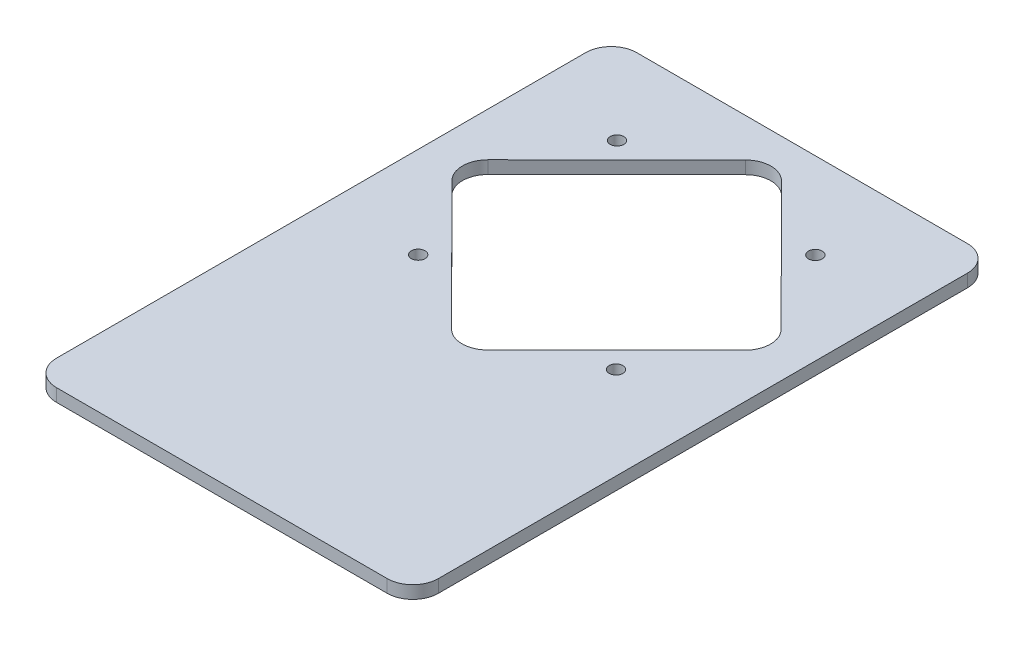
ISO-10303-21;
HEADER;
FILE_DESCRIPTION(('STEP AP214'),'2;1');
FILE_NAME('part.step','',(''),(''),'','','');
FILE_SCHEMA(('AUTOMOTIVE_DESIGN { 1 0 10303 214 1 1 1 1 }'));
ENDSEC;
DATA;
#1=APPLICATION_CONTEXT('core data for automotive mechanical design processes');
#2=APPLICATION_PROTOCOL_DEFINITION('international standard','automotive_design',2000,#1);
#3=PRODUCT_CONTEXT('',#1,'mechanical');
#4=PRODUCT('Part','Part','',(#3));
#5=PRODUCT_RELATED_PRODUCT_CATEGORY('part','',(#4));
#6=PRODUCT_DEFINITION_FORMATION('','',#4);
#7=PRODUCT_DEFINITION_CONTEXT('part definition',#1,'design');
#8=PRODUCT_DEFINITION('design','',#6,#7);
#9=PRODUCT_DEFINITION_SHAPE('','',#8);
#10=(LENGTH_UNIT() NAMED_UNIT(*) SI_UNIT(.MILLI.,.METRE.));
#11=(NAMED_UNIT(*) PLANE_ANGLE_UNIT() SI_UNIT($,.RADIAN.));
#12=(NAMED_UNIT(*) SI_UNIT($,.STERADIAN.) SOLID_ANGLE_UNIT());
#13=UNCERTAINTY_MEASURE_WITH_UNIT(LENGTH_MEASURE(1.E-05),#10,'distance_accuracy_value','');
#14=(GEOMETRIC_REPRESENTATION_CONTEXT(3) GLOBAL_UNCERTAINTY_ASSIGNED_CONTEXT((#13)) GLOBAL_UNIT_ASSIGNED_CONTEXT((#10,
#11,#12)) REPRESENTATION_CONTEXT('',''));
#15=CARTESIAN_POINT('',(0.,0.,0.));
#16=DIRECTION('',(0.,0.,1.));
#17=DIRECTION('',(1.,0.,0.));
#18=AXIS2_PLACEMENT_3D('',#15,#16,#17);
#19=CARTESIAN_POINT('',(94.8320000004922,3.175,0.));
#20=DIRECTION('',(1.,0.,0.));
#21=DIRECTION('',(0.,0.,-1.));
#22=AXIS2_PLACEMENT_3D('',#19,#20,#21);
#23=PLANE('',#22);
#24=DIRECTION('',(0.,0.,1.));
#25=VECTOR('',#24,1.);
#26=CARTESIAN_POINT('',(94.8320000004922,0.,0.));
#27=LINE('',#26,#25);
#28=CARTESIAN_POINT('',(94.8320000004922,0.,-132.141139867739));
#29=VERTEX_POINT('',#28);
#30=CARTESIAN_POINT('',(94.8320000004922,0.,-0.736139867738578));
#31=VERTEX_POINT('',#30);
#32=EDGE_CURVE('E250',#29,#31,#27,.T.);
#33=ORIENTED_EDGE('',*,*,#32,.F.);
#34=DIRECTION('',(0.,-1.,0.));
#35=VECTOR('',#34,1.);
#36=CARTESIAN_POINT('',(94.8320000004922,3.175,-132.141139867739));
#37=LINE('',#36,#35);
#38=CARTESIAN_POINT('',(94.8320000004922,3.175,-132.141139867739));
#39=VERTEX_POINT('',#38);
#40=EDGE_CURVE('E241',#29,#39,#37,.F.);
#41=ORIENTED_EDGE('',*,*,#40,.T.);
#42=DIRECTION('',(0.,0.,1.));
#43=VECTOR('',#42,1.);
#44=CARTESIAN_POINT('',(94.8320000004922,3.175,0.));
#45=LINE('',#44,#43);
#46=CARTESIAN_POINT('',(94.8320000004922,3.175,-0.736139867738578));
#47=VERTEX_POINT('',#46);
#48=EDGE_CURVE('E247',#39,#47,#45,.T.);
#49=ORIENTED_EDGE('',*,*,#48,.T.);
#50=DIRECTION('',(0.,-1.,0.));
#51=VECTOR('',#50,1.);
#52=CARTESIAN_POINT('',(94.8320000004922,0.,-0.736139867738578));
#53=LINE('',#52,#51);
#54=EDGE_CURVE('E238',#47,#31,#53,.T.);
#55=ORIENTED_EDGE('',*,*,#54,.T.);
#56=EDGE_LOOP('',(#33,#41,#49,#55));
#57=FACE_BOUND('',#56,.T.);
#58=ADVANCED_FACE('F37',(#57),#23,.T.);
#59=CARTESIAN_POINT('',(0.,3.175,-138.491139867739));
#60=DIRECTION('',(0.,0.,-1.));
#61=DIRECTION('',(-1.,0.,0.));
#62=AXIS2_PLACEMENT_3D('',#59,#60,#61);
#63=PLANE('',#62);
#64=DIRECTION('',(1.,0.,0.));
#65=VECTOR('',#64,1.);
#66=CARTESIAN_POINT('',(0.,0.,-138.491139867739));
#67=LINE('',#66,#65);
#68=CARTESIAN_POINT('',(6.35000000049217,0.,-138.491139867739));
#69=VERTEX_POINT('',#68);
#70=CARTESIAN_POINT('',(88.4820000004922,0.,-138.491139867739));
#71=VERTEX_POINT('',#70);
#72=EDGE_CURVE('E266',#69,#71,#67,.T.);
#73=ORIENTED_EDGE('',*,*,#72,.F.);
#74=DIRECTION('',(0.,-1.,0.));
#75=VECTOR('',#74,1.);
#76=CARTESIAN_POINT('',(6.35000000049217,3.175,-138.491139867739));
#77=LINE('',#76,#75);
#78=CARTESIAN_POINT('',(6.35000000049217,3.175,-138.491139867739));
#79=VERTEX_POINT('',#78);
#80=EDGE_CURVE('E229',#69,#79,#77,.F.);
#81=ORIENTED_EDGE('',*,*,#80,.T.);
#82=DIRECTION('',(1.,0.,0.));
#83=VECTOR('',#82,1.);
#84=CARTESIAN_POINT('',(0.,3.175,-138.491139867739));
#85=LINE('',#84,#83);
#86=CARTESIAN_POINT('',(88.4820000004922,3.175,-138.491139867739));
#87=VERTEX_POINT('',#86);
#88=EDGE_CURVE('E257',#79,#87,#85,.T.);
#89=ORIENTED_EDGE('',*,*,#88,.T.);
#90=DIRECTION('',(0.,-1.,0.));
#91=VECTOR('',#90,1.);
#92=CARTESIAN_POINT('',(88.4820000004922,3.175,-138.491139867739));
#93=LINE('',#92,#91);
#94=EDGE_CURVE('E226',#87,#71,#93,.T.);
#95=ORIENTED_EDGE('',*,*,#94,.T.);
#96=EDGE_LOOP('',(#73,#81,#89,#95));
#97=FACE_BOUND('',#96,.T.);
#98=ADVANCED_FACE('F265',(#97),#63,.T.);
#99=CARTESIAN_POINT('',(4.92185765983351E-10,3.175,0.));
#100=DIRECTION('',(1.,0.,0.));
#101=DIRECTION('',(0.,0.,-1.));
#102=AXIS2_PLACEMENT_3D('',#99,#100,#101);
#103=PLANE('',#102);
#104=DIRECTION('',(0.,0.,1.));
#105=VECTOR('',#104,1.);
#106=CARTESIAN_POINT('',(4.92185765983351E-10,3.175,0.));
#107=LINE('',#106,#105);
#108=CARTESIAN_POINT('',(4.92169583360953E-10,3.175,-132.141139867739));
#109=VERTEX_POINT('',#108);
#110=CARTESIAN_POINT('',(4.92185675832218E-10,3.175,-0.73613986773857));
#111=VERTEX_POINT('',#110);
#112=EDGE_CURVE('E182',#109,#111,#107,.T.);
#113=ORIENTED_EDGE('',*,*,#112,.F.);
#114=DIRECTION('',(0.,-1.,0.));
#115=VECTOR('',#114,1.);
#116=CARTESIAN_POINT('',(4.92169583360953E-10,0.,-132.141139867739));
#117=LINE('',#116,#115);
#118=CARTESIAN_POINT('',(4.92169583360953E-10,0.,-132.141139867739));
#119=VERTEX_POINT('',#118);
#120=EDGE_CURVE('E215',#109,#119,#117,.T.);
#121=ORIENTED_EDGE('',*,*,#120,.T.);
#122=DIRECTION('',(0.,0.,1.));
#123=VECTOR('',#122,1.);
#124=CARTESIAN_POINT('',(4.92185765983351E-10,0.,0.));
#125=LINE('',#124,#123);
#126=CARTESIAN_POINT('',(4.92185675832218E-10,0.,-0.73613986773857));
#127=VERTEX_POINT('',#126);
#128=EDGE_CURVE('E269',#119,#127,#125,.T.);
#129=ORIENTED_EDGE('',*,*,#128,.T.);
#130=DIRECTION('',(0.,-1.,0.));
#131=VECTOR('',#130,1.);
#132=CARTESIAN_POINT('',(4.92185675832218E-10,3.175,-0.73613986773857));
#133=LINE('',#132,#131);
#134=EDGE_CURVE('E213',#127,#111,#133,.F.);
#135=ORIENTED_EDGE('',*,*,#134,.T.);
#136=EDGE_LOOP('',(#113,#121,#129,#135));
#137=FACE_BOUND('',#136,.T.);
#138=ADVANCED_FACE('F332',(#137),#103,.F.);
#139=CARTESIAN_POINT('',(90.4718170508461,3.175,-90.1963340732878));
#140=DIRECTION('',(-0.708184155043819,0.,0.706027763296084));
#141=DIRECTION('',(0.706027763296084,0.,0.708184155043819));
#142=AXIS2_PLACEMENT_3D('',#139,#140,#141);
#143=PLANE('',#142);
#144=DIRECTION('',(-0.706027763296084,0.,-0.708184155043819));
#145=VECTOR('',#144,1.);
#146=CARTESIAN_POINT('',(90.4718170508461,0.,-90.1963340732878));
#147=LINE('',#146,#145);
#148=CARTESIAN_POINT('',(83.7940805565689,0.,-96.8944661052738));
#149=VERTEX_POINT('',#148);
#150=CARTESIAN_POINT('',(51.8992762974223,0.,-128.886685361784));
#151=VERTEX_POINT('',#150);
#152=EDGE_CURVE('E276',#149,#151,#147,.T.);
#153=ORIENTED_EDGE('',*,*,#152,.F.);
#154=DIRECTION('',(0.,-1.,0.));
#155=VECTOR('',#154,1.);
#156=CARTESIAN_POINT('',(83.7940805565689,3.175,-96.8944661052738));
#157=LINE('',#156,#155);
#158=CARTESIAN_POINT('',(83.7940805565689,3.175,-96.8944661052738));
#159=VERTEX_POINT('',#158);
#160=EDGE_CURVE('E195',#149,#159,#157,.F.);
#161=ORIENTED_EDGE('',*,*,#160,.T.);
#162=DIRECTION('',(-0.706027763296084,0.,-0.708184155043819));
#163=VECTOR('',#162,1.);
#164=CARTESIAN_POINT('',(90.4718170508461,3.175,-90.1963340732878));
#165=LINE('',#164,#163);
#166=CARTESIAN_POINT('',(51.8992762974223,3.175,-128.886685361784));
#167=VERTEX_POINT('',#166);
#168=EDGE_CURVE('E300',#159,#167,#165,.T.);
#169=ORIENTED_EDGE('',*,*,#168,.T.);
#170=DIRECTION('',(0.,-1.,0.));
#171=VECTOR('',#170,1.);
#172=CARTESIAN_POINT('',(51.8992762974223,3.175,-128.886685361784));
#173=LINE('',#172,#171);
#174=EDGE_CURVE('E192',#167,#151,#173,.T.);
#175=ORIENTED_EDGE('',*,*,#174,.T.);
#176=EDGE_LOOP('',(#153,#161,#169,#175));
#177=FACE_BOUND('',#176,.T.);
#178=ADVANCED_FACE('F346',(#177),#143,.T.);
#179=CARTESIAN_POINT('',(-2.19446019734699,3.175,-2.20116264745773));
#180=DIRECTION('',(-0.706027763296084,0.,-0.708184155043819));
#181=DIRECTION('',(-0.708184155043819,0.,0.706027763296084));
#182=AXIS2_PLACEMENT_3D('',#179,#180,#181);
#183=PLANE('',#182);
#184=DIRECTION('',(0.708184155043819,0.,-0.706027763296084));
#185=VECTOR('',#184,1.);
#186=CARTESIAN_POINT('',(-2.19446019734699,0.,-2.20116264745773));
#187=LINE('',#186,#185);
#188=CARTESIAN_POINT('',(51.7881682124607,0.,-56.0194161646687));
#189=VERTEX_POINT('',#188);
#190=CARTESIAN_POINT('',(83.7803874689708,0.,-87.9142204238154));
#191=VERTEX_POINT('',#190);
#192=EDGE_CURVE('E174',#189,#191,#187,.T.);
#193=ORIENTED_EDGE('',*,*,#192,.F.);
#194=DIRECTION('',(0.,-1.,0.));
#195=VECTOR('',#194,1.);
#196=CARTESIAN_POINT('',(51.7881682124607,3.175,-56.0194161646687));
#197=LINE('',#196,#195);
#198=CARTESIAN_POINT('',(51.7881682124607,3.175,-56.0194161646687));
#199=VERTEX_POINT('',#198);
#200=EDGE_CURVE('E190',#189,#199,#197,.F.);
#201=ORIENTED_EDGE('',*,*,#200,.T.);
#202=DIRECTION('',(0.708184155043819,0.,-0.706027763296084));
#203=VECTOR('',#202,1.);
#204=CARTESIAN_POINT('',(-2.19446019734699,3.175,-2.20116264745773));
#205=LINE('',#204,#203);
#206=CARTESIAN_POINT('',(83.7803874689708,3.175,-87.9142204238154));
#207=VERTEX_POINT('',#206);
#208=EDGE_CURVE('E297',#199,#207,#205,.T.);
#209=ORIENTED_EDGE('',*,*,#208,.T.);
#210=DIRECTION('',(0.,-1.,0.));
#211=VECTOR('',#210,1.);
#212=CARTESIAN_POINT('',(83.7803874689708,0.,-87.9142204238154));
#213=LINE('',#212,#211);
#214=EDGE_CURVE('E180',#207,#191,#213,.T.);
#215=ORIENTED_EDGE('',*,*,#214,.T.);
#216=EDGE_LOOP('',(#193,#201,#209,#215));
#217=FACE_BOUND('',#216,.T.);
#218=ADVANCED_FACE('F343',(#217),#183,.T.);
#219=CARTESIAN_POINT('',(49.4856590252794,3.175,-49.3349772202809));
#220=DIRECTION('',(0.708184155043819,0.,-0.706027763296084));
#221=DIRECTION('',(-0.706027763296084,0.,-0.708184155043819));
#222=AXIS2_PLACEMENT_3D('',#219,#220,#221);
#223=PLANE('',#222);
#224=DIRECTION('',(0.706027763296084,0.,0.70818415504382));
#225=VECTOR('',#224,1.);
#226=CARTESIAN_POINT('',(49.4856590252794,3.175,-49.3349772202809));
#227=LINE('',#226,#225);
#228=CARTESIAN_POINT('',(10.9131182718556,3.175,-88.025328508777));
#229=VERTEX_POINT('',#228);
#230=CARTESIAN_POINT('',(42.8079225310023,3.175,-56.0331092522669));
#231=VERTEX_POINT('',#230);
#232=EDGE_CURVE('E295',#229,#231,#227,.T.);
#233=ORIENTED_EDGE('',*,*,#232,.T.);
#234=DIRECTION('',(0.,-1.,0.));
#235=VECTOR('',#234,1.);
#236=CARTESIAN_POINT('',(42.8079225310023,0.,-56.0331092522669));
#237=LINE('',#236,#235);
#238=CARTESIAN_POINT('',(42.8079225310023,0.,-56.0331092522669));
#239=VERTEX_POINT('',#238);
#240=EDGE_CURVE('E173',#231,#239,#237,.T.);
#241=ORIENTED_EDGE('',*,*,#240,.T.);
#242=DIRECTION('',(0.706027763296084,0.,0.70818415504382));
#243=VECTOR('',#242,1.);
#244=CARTESIAN_POINT('',(49.4856590252794,0.,-49.3349772202809));
#245=LINE('',#244,#243);
#246=CARTESIAN_POINT('',(10.9131182718556,0.,-88.025328508777));
#247=VERTEX_POINT('',#246);
#248=EDGE_CURVE('E156',#247,#239,#245,.T.);
#249=ORIENTED_EDGE('',*,*,#248,.F.);
#250=DIRECTION('',(0.,-1.,0.));
#251=VECTOR('',#250,1.);
#252=CARTESIAN_POINT('',(10.9131182718556,3.175,-88.025328508777));
#253=LINE('',#252,#251);
#254=EDGE_CURVE('E170',#247,#229,#253,.F.);
#255=ORIENTED_EDGE('',*,*,#254,.T.);
#256=EDGE_LOOP('',(#233,#241,#249,#255));
#257=FACE_BOUND('',#256,.T.);
#258=ADVANCED_FACE('F169',(#257),#223,.T.);
#259=CARTESIAN_POINT('',(-43.0558170503539,3.175,-43.1873206730244));
#260=DIRECTION('',(-0.706027763296084,0.,-0.708184155043819));
#261=DIRECTION('',(-0.70818415504382,0.,0.706027763296084));
#262=AXIS2_PLACEMENT_3D('',#259,#260,#261);
#263=PLANE('',#262);
#264=DIRECTION('',(0.70818415504382,0.,-0.706027763296084));
#265=VECTOR('',#264,1.);
#266=CARTESIAN_POINT('',(-43.0558170503539,0.,-43.1873206730244));
#267=LINE('',#266,#265);
#268=CARTESIAN_POINT('',(10.9268113594537,0.,-97.0055741902354));
#269=VERTEX_POINT('',#268);
#270=CARTESIAN_POINT('',(42.9190306159639,0.,-128.900378449382));
#271=VERTEX_POINT('',#270);
#272=EDGE_CURVE('E158',#269,#271,#267,.T.);
#273=ORIENTED_EDGE('',*,*,#272,.T.);
#274=DIRECTION('',(0.,-1.,0.));
#275=VECTOR('',#274,1.);
#276=CARTESIAN_POINT('',(42.9190306159639,3.175,-128.900378449382));
#277=LINE('',#276,#275);
#278=CARTESIAN_POINT('',(42.9190306159639,3.175,-128.900378449382));
#279=VERTEX_POINT('',#278);
#280=EDGE_CURVE('E199',#271,#279,#277,.F.);
#281=ORIENTED_EDGE('',*,*,#280,.T.);
#282=DIRECTION('',(0.70818415504382,0.,-0.706027763296084));
#283=VECTOR('',#282,1.);
#284=CARTESIAN_POINT('',(-43.0558170503539,3.175,-43.1873206730244));
#285=LINE('',#284,#283);
#286=CARTESIAN_POINT('',(10.9268113594537,3.175,-97.0055741902354));
#287=VERTEX_POINT('',#286);
#288=EDGE_CURVE('E258',#287,#279,#285,.T.);
#289=ORIENTED_EDGE('',*,*,#288,.F.);
#290=DIRECTION('',(0.,-1.,0.));
#291=VECTOR('',#290,1.);
#292=CARTESIAN_POINT('',(10.9268113594537,3.175,-97.0055741902354));
#293=LINE('',#292,#291);
#294=EDGE_CURVE('E197',#287,#269,#293,.T.);
#295=ORIENTED_EDGE('',*,*,#294,.T.);
#296=EDGE_LOOP('',(#273,#281,#289,#295));
#297=FACE_BOUND('',#296,.T.);
#298=ADVANCED_FACE('F336',(#297),#263,.F.);
#299=CARTESIAN_POINT('',(22.7875000004922,3.175,-117.150797893305));
#300=DIRECTION('',(0.,-1.,0.));
#301=DIRECTION('',(0.,0.,-1.));
#302=AXIS2_PLACEMENT_3D('',#299,#300,#301);
#303=CYLINDRICAL_SURFACE('',#302,1.7);
#304=CARTESIAN_POINT('',(22.7875000004922,3.175,-117.150797893305));
#305=DIRECTION('',(0.,1.,0.));
#306=DIRECTION('',(0.,0.,1.));
#307=AXIS2_PLACEMENT_3D('',#304,#305,#306);
#308=CIRCLE('',#307,1.7);
#309=CARTESIAN_POINT('',(22.7875000004922,3.175,-115.450797893305));
#310=VERTEX_POINT('',#309);
#311=EDGE_CURVE('E303',#310,#310,#308,.T.);
#312=ORIENTED_EDGE('',*,*,#311,.T.);
#313=EDGE_LOOP('',(#312));
#314=FACE_BOUND('',#313,.T.);
#315=CARTESIAN_POINT('',(22.7875000004922,0.,-117.150797893305));
#316=DIRECTION('',(0.,1.,0.));
#317=DIRECTION('',(0.,0.,1.));
#318=AXIS2_PLACEMENT_3D('',#315,#316,#317);
#319=CIRCLE('',#318,1.7);
#320=CARTESIAN_POINT('',(22.7875000004922,0.,-115.450797893305));
#321=VERTEX_POINT('',#320);
#322=EDGE_CURVE('E279',#321,#321,#319,.T.);
#323=ORIENTED_EDGE('',*,*,#322,.F.);
#324=EDGE_LOOP('',(#323));
#325=FACE_BOUND('',#324,.T.);
#326=ADVANCED_FACE('F339',(#314,#325),#303,.F.);
#327=CARTESIAN_POINT('',(72.0445000004922,3.175,-117.150797893305));
#328=DIRECTION('',(0.,-1.,0.));
#329=DIRECTION('',(0.,0.,-1.));
#330=AXIS2_PLACEMENT_3D('',#327,#328,#329);
#331=CYLINDRICAL_SURFACE('',#330,1.70000000000001);
#332=CARTESIAN_POINT('',(72.0445000004922,3.175,-117.150797893305));
#333=DIRECTION('',(0.,1.,0.));
#334=DIRECTION('',(0.,0.,1.));
#335=AXIS2_PLACEMENT_3D('',#332,#333,#334);
#336=CIRCLE('',#335,1.70000000000001);
#337=CARTESIAN_POINT('',(72.0445000004922,3.175,-115.450797893305));
#338=VERTEX_POINT('',#337);
#339=EDGE_CURVE('E306',#338,#338,#336,.T.);
#340=ORIENTED_EDGE('',*,*,#339,.T.);
#341=EDGE_LOOP('',(#340));
#342=FACE_BOUND('',#341,.T.);
#343=CARTESIAN_POINT('',(72.0445000004922,0.,-117.150797893305));
#344=DIRECTION('',(0.,1.,0.));
#345=DIRECTION('',(0.,0.,1.));
#346=AXIS2_PLACEMENT_3D('',#343,#344,#345);
#347=CIRCLE('',#346,1.70000000000001);
#348=CARTESIAN_POINT('',(72.0445000004922,0.,-115.450797893305));
#349=VERTEX_POINT('',#348);
#350=EDGE_CURVE('E282',#349,#349,#347,.T.);
#351=ORIENTED_EDGE('',*,*,#350,.F.);
#352=EDGE_LOOP('',(#351));
#353=FACE_BOUND('',#352,.T.);
#354=ADVANCED_FACE('F353',(#342,#353),#331,.F.);
#355=CARTESIAN_POINT('',(71.9196988279324,3.175,-67.7689967207455));
#356=DIRECTION('',(0.,-1.,0.));
#357=DIRECTION('',(0.,0.,-1.));
#358=AXIS2_PLACEMENT_3D('',#355,#356,#357);
#359=CYLINDRICAL_SURFACE('',#358,1.70000000000001);
#360=CARTESIAN_POINT('',(71.9196988279324,3.175,-67.7689967207455));
#361=DIRECTION('',(0.,1.,0.));
#362=DIRECTION('',(0.,0.,1.));
#363=AXIS2_PLACEMENT_3D('',#360,#361,#362);
#364=CIRCLE('',#363,1.70000000000001);
#365=CARTESIAN_POINT('',(71.9196988279324,3.175,-66.0689967207455));
#366=VERTEX_POINT('',#365);
#367=EDGE_CURVE('E309',#366,#366,#364,.T.);
#368=ORIENTED_EDGE('',*,*,#367,.T.);
#369=EDGE_LOOP('',(#368));
#370=FACE_BOUND('',#369,.T.);
#371=CARTESIAN_POINT('',(71.9196988279324,0.,-67.7689967207455));
#372=DIRECTION('',(0.,1.,0.));
#373=DIRECTION('',(0.,0.,1.));
#374=AXIS2_PLACEMENT_3D('',#371,#372,#373);
#375=CIRCLE('',#374,1.70000000000001);
#376=CARTESIAN_POINT('',(71.9196988279324,0.,-66.0689967207455));
#377=VERTEX_POINT('',#376);
#378=EDGE_CURVE('E285',#377,#377,#375,.T.);
#379=ORIENTED_EDGE('',*,*,#378,.F.);
#380=EDGE_LOOP('',(#379));
#381=FACE_BOUND('',#380,.T.);
#382=ADVANCED_FACE('F357',(#370,#381),#359,.F.);
#383=CARTESIAN_POINT('',(22.6626988279324,3.175,-67.8937978933053));
#384=DIRECTION('',(0.,-1.,0.));
#385=DIRECTION('',(0.,0.,-1.));
#386=AXIS2_PLACEMENT_3D('',#383,#384,#385);
#387=CYLINDRICAL_SURFACE('',#386,1.7);
#388=CARTESIAN_POINT('',(22.6626988279324,3.175,-67.8937978933053));
#389=DIRECTION('',(0.,1.,0.));
#390=DIRECTION('',(0.,0.,1.));
#391=AXIS2_PLACEMENT_3D('',#388,#389,#390);
#392=CIRCLE('',#391,1.7);
#393=CARTESIAN_POINT('',(22.6626988279324,3.175,-66.1937978933053));
#394=VERTEX_POINT('',#393);
#395=EDGE_CURVE('E312',#394,#394,#392,.T.);
#396=ORIENTED_EDGE('',*,*,#395,.T.);
#397=EDGE_LOOP('',(#396));
#398=FACE_BOUND('',#397,.T.);
#399=CARTESIAN_POINT('',(22.6626988279324,0.,-67.8937978933053));
#400=DIRECTION('',(0.,1.,0.));
#401=DIRECTION('',(0.,0.,1.));
#402=AXIS2_PLACEMENT_3D('',#399,#400,#401);
#403=CIRCLE('',#402,1.7);
#404=CARTESIAN_POINT('',(22.6626988279324,0.,-66.1937978933053));
#405=VERTEX_POINT('',#404);
#406=EDGE_CURVE('E288',#405,#405,#403,.T.);
#407=ORIENTED_EDGE('',*,*,#406,.F.);
#408=EDGE_LOOP('',(#407));
#409=FACE_BOUND('',#408,.T.);
#410=ADVANCED_FACE('F361',(#398,#409),#387,.F.);
#411=CARTESIAN_POINT('',(0.,3.175,5.61386013226143));
#412=DIRECTION('',(0.,0.,-1.));
#413=DIRECTION('',(-1.,0.,0.));
#414=AXIS2_PLACEMENT_3D('',#411,#412,#413);
#415=PLANE('',#414);
#416=DIRECTION('',(1.,0.,0.));
#417=VECTOR('',#416,1.);
#418=CARTESIAN_POINT('',(0.,3.175,5.61386013226143));
#419=LINE('',#418,#417);
#420=CARTESIAN_POINT('',(6.35000000049219,3.175,5.61386013226143));
#421=VERTEX_POINT('',#420);
#422=CARTESIAN_POINT('',(88.4820000004922,3.175,5.61386013226142));
#423=VERTEX_POINT('',#422);
#424=EDGE_CURVE('E178',#421,#423,#419,.T.);
#425=ORIENTED_EDGE('',*,*,#424,.F.);
#426=DIRECTION('',(0.,-1.,0.));
#427=VECTOR('',#426,1.);
#428=CARTESIAN_POINT('',(6.35000000049219,3.175,5.61386013226143));
#429=LINE('',#428,#427);
#430=CARTESIAN_POINT('',(6.35000000049219,0.,5.61386013226143));
#431=VERTEX_POINT('',#430);
#432=EDGE_CURVE('E11',#421,#431,#429,.T.);
#433=ORIENTED_EDGE('',*,*,#432,.T.);
#434=DIRECTION('',(1.,0.,0.));
#435=VECTOR('',#434,1.);
#436=CARTESIAN_POINT('',(0.,0.,5.61386013226143));
#437=LINE('',#436,#435);
#438=CARTESIAN_POINT('',(88.4820000004922,0.,5.61386013226142));
#439=VERTEX_POINT('',#438);
#440=EDGE_CURVE('E185',#431,#439,#437,.T.);
#441=ORIENTED_EDGE('',*,*,#440,.T.);
#442=DIRECTION('',(0.,-1.,0.));
#443=VECTOR('',#442,1.);
#444=CARTESIAN_POINT('',(88.4820000004922,3.175,5.61386013226142));
#445=LINE('',#444,#443);
#446=EDGE_CURVE('E45',#439,#423,#445,.F.);
#447=ORIENTED_EDGE('',*,*,#446,.T.);
#448=EDGE_LOOP('',(#425,#433,#441,#447));
#449=FACE_BOUND('',#448,.T.);
#450=ADVANCED_FACE('F317',(#449),#415,.F.);
#451=CARTESIAN_POINT('',(0.,3.175,0.));
#452=DIRECTION('',(0.,1.,0.));
#453=DIRECTION('',(0.,0.,1.));
#454=AXIS2_PLACEMENT_3D('',#451,#452,#453);
#455=PLANE('',#454);
#456=ORIENTED_EDGE('',*,*,#395,.F.);
#457=EDGE_LOOP('',(#456));
#458=FACE_BOUND('',#457,.T.);
#459=ORIENTED_EDGE('',*,*,#367,.F.);
#460=EDGE_LOOP('',(#459));
#461=FACE_BOUND('',#460,.T.);
#462=ORIENTED_EDGE('',*,*,#339,.F.);
#463=EDGE_LOOP('',(#462));
#464=FACE_BOUND('',#463,.T.);
#465=ORIENTED_EDGE('',*,*,#311,.F.);
#466=EDGE_LOOP('',(#465));
#467=FACE_BOUND('',#466,.T.);
#468=ORIENTED_EDGE('',*,*,#168,.F.);
#469=CARTESIAN_POINT('',(79.2971111720407,3.175,-92.4111898083437));
#470=DIRECTION('',(0.,1.,0.));
#471=DIRECTION('',(0.,0.,1.));
#472=AXIS2_PLACEMENT_3D('',#469,#470,#471);
#473=CIRCLE('',#472,6.35);
#474=EDGE_CURVE('E207',#159,#207,#473,.F.);
#475=ORIENTED_EDGE('',*,*,#474,.T.);
#476=ORIENTED_EDGE('',*,*,#208,.F.);
#477=CARTESIAN_POINT('',(47.3048919155305,3.175,-60.516385549197));
#478=DIRECTION('',(0.,1.,0.));
#479=DIRECTION('',(0.,0.,1.));
#480=AXIS2_PLACEMENT_3D('',#477,#478,#479);
#481=CIRCLE('',#480,6.35);
#482=EDGE_CURVE('E203',#199,#231,#481,.F.);
#483=ORIENTED_EDGE('',*,*,#482,.T.);
#484=ORIENTED_EDGE('',*,*,#232,.F.);
#485=CARTESIAN_POINT('',(15.4100876563839,3.175,-92.5086048057072));
#486=DIRECTION('',(0.,1.,0.));
#487=DIRECTION('',(0.,0.,1.));
#488=AXIS2_PLACEMENT_3D('',#485,#486,#487);
#489=CIRCLE('',#488,6.35);
#490=EDGE_CURVE('E163',#229,#287,#489,.F.);
#491=ORIENTED_EDGE('',*,*,#490,.T.);
#492=ORIENTED_EDGE('',*,*,#288,.T.);
#493=CARTESIAN_POINT('',(47.402306912894,3.175,-124.403409064854));
#494=DIRECTION('',(0.,1.,0.));
#495=DIRECTION('',(0.,0.,1.));
#496=AXIS2_PLACEMENT_3D('',#493,#494,#495);
#497=CIRCLE('',#496,6.35);
#498=EDGE_CURVE('E164',#279,#167,#497,.F.);
#499=ORIENTED_EDGE('',*,*,#498,.T.);
#500=EDGE_LOOP('',(#468,#475,#476,#483,#484,#491,#492,#499));
#501=FACE_BOUND('',#500,.T.);
#502=ORIENTED_EDGE('',*,*,#88,.F.);
#503=CARTESIAN_POINT('',(6.35000000049217,3.175,-132.141139867739));
#504=DIRECTION('',(0.,1.,0.));
#505=DIRECTION('',(0.,0.,1.));
#506=AXIS2_PLACEMENT_3D('',#503,#504,#505);
#507=CIRCLE('',#506,6.35);
#508=EDGE_CURVE('E236',#79,#109,#507,.T.);
#509=ORIENTED_EDGE('',*,*,#508,.T.);
#510=ORIENTED_EDGE('',*,*,#112,.T.);
#511=CARTESIAN_POINT('',(6.35000000049219,3.175,-0.736139867738571));
#512=DIRECTION('',(0.,1.,0.));
#513=DIRECTION('',(0.,0.,1.));
#514=AXIS2_PLACEMENT_3D('',#511,#512,#513);
#515=CIRCLE('',#514,6.35);
#516=EDGE_CURVE('E58',#111,#421,#515,.T.);
#517=ORIENTED_EDGE('',*,*,#516,.T.);
#518=ORIENTED_EDGE('',*,*,#424,.T.);
#519=CARTESIAN_POINT('',(88.4820000004922,3.175,-0.736139867738577));
#520=DIRECTION('',(0.,1.,0.));
#521=DIRECTION('',(0.,0.,1.));
#522=AXIS2_PLACEMENT_3D('',#519,#520,#521);
#523=CIRCLE('',#522,6.35);
#524=EDGE_CURVE('E231',#423,#47,#523,.T.);
#525=ORIENTED_EDGE('',*,*,#524,.T.);
#526=ORIENTED_EDGE('',*,*,#48,.F.);
#527=CARTESIAN_POINT('',(88.4820000004922,3.175,-132.141139867739));
#528=DIRECTION('',(0.,1.,0.));
#529=DIRECTION('',(0.,0.,1.));
#530=AXIS2_PLACEMENT_3D('',#527,#528,#529);
#531=CIRCLE('',#530,6.35);
#532=EDGE_CURVE('E234',#39,#87,#531,.T.);
#533=ORIENTED_EDGE('',*,*,#532,.T.);
#534=EDGE_LOOP('',(#502,#509,#510,#517,#518,#525,#526,#533));
#535=FACE_BOUND('',#534,.T.);
#536=ADVANCED_FACE('F254',(#458,#461,#464,#467,#501,#535),#455,.T.);
#537=CARTESIAN_POINT('',(0.,0.,0.));
#538=DIRECTION('',(0.,1.,0.));
#539=DIRECTION('',(0.,0.,1.));
#540=AXIS2_PLACEMENT_3D('',#537,#538,#539);
#541=PLANE('',#540);
#542=ORIENTED_EDGE('',*,*,#406,.T.);
#543=EDGE_LOOP('',(#542));
#544=FACE_BOUND('',#543,.T.);
#545=ORIENTED_EDGE('',*,*,#378,.T.);
#546=EDGE_LOOP('',(#545));
#547=FACE_BOUND('',#546,.T.);
#548=ORIENTED_EDGE('',*,*,#350,.T.);
#549=EDGE_LOOP('',(#548));
#550=FACE_BOUND('',#549,.T.);
#551=ORIENTED_EDGE('',*,*,#322,.T.);
#552=EDGE_LOOP('',(#551));
#553=FACE_BOUND('',#552,.T.);
#554=ORIENTED_EDGE('',*,*,#192,.T.);
#555=CARTESIAN_POINT('',(79.2971111720407,0.,-92.4111898083437));
#556=DIRECTION('',(0.,1.,0.));
#557=DIRECTION('',(0.,0.,1.));
#558=AXIS2_PLACEMENT_3D('',#555,#556,#557);
#559=CIRCLE('',#558,6.35);
#560=EDGE_CURVE('E205',#191,#149,#559,.T.);
#561=ORIENTED_EDGE('',*,*,#560,.T.);
#562=ORIENTED_EDGE('',*,*,#152,.T.);
#563=CARTESIAN_POINT('',(47.402306912894,0.,-124.403409064854));
#564=DIRECTION('',(0.,1.,0.));
#565=DIRECTION('',(0.,0.,1.));
#566=AXIS2_PLACEMENT_3D('',#563,#564,#565);
#567=CIRCLE('',#566,6.35);
#568=EDGE_CURVE('E209',#151,#271,#567,.T.);
#569=ORIENTED_EDGE('',*,*,#568,.T.);
#570=ORIENTED_EDGE('',*,*,#272,.F.);
#571=CARTESIAN_POINT('',(15.4100876563839,0.,-92.5086048057072));
#572=DIRECTION('',(0.,1.,0.));
#573=DIRECTION('',(0.,0.,1.));
#574=AXIS2_PLACEMENT_3D('',#571,#572,#573);
#575=CIRCLE('',#574,6.35);
#576=EDGE_CURVE('E151',#269,#247,#575,.T.);
#577=ORIENTED_EDGE('',*,*,#576,.T.);
#578=ORIENTED_EDGE('',*,*,#248,.T.);
#579=CARTESIAN_POINT('',(47.3048919155305,0.,-60.516385549197));
#580=DIRECTION('',(0.,1.,0.));
#581=DIRECTION('',(0.,0.,1.));
#582=AXIS2_PLACEMENT_3D('',#579,#580,#581);
#583=CIRCLE('',#582,6.35);
#584=EDGE_CURVE('E201',#239,#189,#583,.T.);
#585=ORIENTED_EDGE('',*,*,#584,.T.);
#586=EDGE_LOOP('',(#554,#561,#562,#569,#570,#577,#578,#585));
#587=FACE_BOUND('',#586,.T.);
#588=ORIENTED_EDGE('',*,*,#128,.F.);
#589=CARTESIAN_POINT('',(6.35000000049217,0.,-132.141139867739));
#590=DIRECTION('',(0.,1.,0.));
#591=DIRECTION('',(0.,0.,1.));
#592=AXIS2_PLACEMENT_3D('',#589,#590,#591);
#593=CIRCLE('',#592,6.35);
#594=EDGE_CURVE('E224',#119,#69,#593,.F.);
#595=ORIENTED_EDGE('',*,*,#594,.T.);
#596=ORIENTED_EDGE('',*,*,#72,.T.);
#597=CARTESIAN_POINT('',(88.4820000004922,0.,-132.141139867739));
#598=DIRECTION('',(0.,1.,0.));
#599=DIRECTION('',(0.,0.,1.));
#600=AXIS2_PLACEMENT_3D('',#597,#598,#599);
#601=CIRCLE('',#600,6.35);
#602=EDGE_CURVE('E222',#71,#29,#601,.F.);
#603=ORIENTED_EDGE('',*,*,#602,.T.);
#604=ORIENTED_EDGE('',*,*,#32,.T.);
#605=CARTESIAN_POINT('',(88.4820000004922,0.,-0.736139867738577));
#606=DIRECTION('',(0.,1.,0.));
#607=DIRECTION('',(0.,0.,1.));
#608=AXIS2_PLACEMENT_3D('',#605,#606,#607);
#609=CIRCLE('',#608,6.35);
#610=EDGE_CURVE('E218',#31,#439,#609,.F.);
#611=ORIENTED_EDGE('',*,*,#610,.T.);
#612=ORIENTED_EDGE('',*,*,#440,.F.);
#613=CARTESIAN_POINT('',(6.35000000049219,0.,-0.736139867738571));
#614=DIRECTION('',(0.,1.,0.));
#615=DIRECTION('',(0.,0.,1.));
#616=AXIS2_PLACEMENT_3D('',#613,#614,#615);
#617=CIRCLE('',#616,6.35);
#618=EDGE_CURVE('E220',#431,#127,#617,.F.);
#619=ORIENTED_EDGE('',*,*,#618,.T.);
#620=EDGE_LOOP('',(#588,#595,#596,#603,#604,#611,#612,#619));
#621=FACE_BOUND('',#620,.T.);
#622=ADVANCED_FACE('F154',(#544,#547,#550,#553,#587,#621),#541,.F.);
#623=CARTESIAN_POINT('',(47.3048919155305,3.175,-60.516385549197));
#624=DIRECTION('',(0.,1.,0.));
#625=DIRECTION('',(0.,0.,1.));
#626=AXIS2_PLACEMENT_3D('',#623,#624,#625);
#627=CYLINDRICAL_SURFACE('',#626,6.35);
#628=ORIENTED_EDGE('',*,*,#482,.F.);
#629=ORIENTED_EDGE('',*,*,#200,.F.);
#630=ORIENTED_EDGE('',*,*,#584,.F.);
#631=ORIENTED_EDGE('',*,*,#240,.F.);
#632=EDGE_LOOP('',(#628,#629,#630,#631));
#633=FACE_BOUND('',#632,.T.);
#634=ADVANCED_FACE('F365',(#633),#627,.F.);
#635=CARTESIAN_POINT('',(79.2971111720407,3.175,-92.4111898083437));
#636=DIRECTION('',(0.,1.,0.));
#637=DIRECTION('',(0.,0.,1.));
#638=AXIS2_PLACEMENT_3D('',#635,#636,#637);
#639=CYLINDRICAL_SURFACE('',#638,6.35);
#640=ORIENTED_EDGE('',*,*,#474,.F.);
#641=ORIENTED_EDGE('',*,*,#160,.F.);
#642=ORIENTED_EDGE('',*,*,#560,.F.);
#643=ORIENTED_EDGE('',*,*,#214,.F.);
#644=EDGE_LOOP('',(#640,#641,#642,#643));
#645=FACE_BOUND('',#644,.T.);
#646=ADVANCED_FACE('F368',(#645),#639,.F.);
#647=CARTESIAN_POINT('',(47.402306912894,3.175,-124.403409064854));
#648=DIRECTION('',(0.,-1.,0.));
#649=DIRECTION('',(0.,0.,-1.));
#650=AXIS2_PLACEMENT_3D('',#647,#648,#649);
#651=CYLINDRICAL_SURFACE('',#650,6.35);
#652=ORIENTED_EDGE('',*,*,#498,.F.);
#653=ORIENTED_EDGE('',*,*,#280,.F.);
#654=ORIENTED_EDGE('',*,*,#568,.F.);
#655=ORIENTED_EDGE('',*,*,#174,.F.);
#656=EDGE_LOOP('',(#652,#653,#654,#655));
#657=FACE_BOUND('',#656,.T.);
#658=ADVANCED_FACE('F372',(#657),#651,.F.);
#659=CARTESIAN_POINT('',(15.4100876563839,3.175,-92.5086048057072));
#660=DIRECTION('',(0.,-1.,0.));
#661=DIRECTION('',(0.,0.,-1.));
#662=AXIS2_PLACEMENT_3D('',#659,#660,#661);
#663=CYLINDRICAL_SURFACE('',#662,6.35);
#664=ORIENTED_EDGE('',*,*,#490,.F.);
#665=ORIENTED_EDGE('',*,*,#254,.F.);
#666=ORIENTED_EDGE('',*,*,#576,.F.);
#667=ORIENTED_EDGE('',*,*,#294,.F.);
#668=EDGE_LOOP('',(#664,#665,#666,#667));
#669=FACE_BOUND('',#668,.T.);
#670=ADVANCED_FACE('F177',(#669),#663,.F.);
#671=CARTESIAN_POINT('',(6.35000000049217,3.175,-132.141139867739));
#672=DIRECTION('',(0.,1.,0.));
#673=DIRECTION('',(0.,0.,1.));
#674=AXIS2_PLACEMENT_3D('',#671,#672,#673);
#675=CYLINDRICAL_SURFACE('',#674,6.35);
#676=ORIENTED_EDGE('',*,*,#508,.F.);
#677=ORIENTED_EDGE('',*,*,#80,.F.);
#678=ORIENTED_EDGE('',*,*,#594,.F.);
#679=ORIENTED_EDGE('',*,*,#120,.F.);
#680=EDGE_LOOP('',(#676,#677,#678,#679));
#681=FACE_BOUND('',#680,.T.);
#682=ADVANCED_FACE('F379',(#681),#675,.T.);
#683=CARTESIAN_POINT('',(88.4820000004922,3.175,-132.141139867739));
#684=DIRECTION('',(0.,-1.,0.));
#685=DIRECTION('',(0.,0.,-1.));
#686=AXIS2_PLACEMENT_3D('',#683,#684,#685);
#687=CYLINDRICAL_SURFACE('',#686,6.35);
#688=ORIENTED_EDGE('',*,*,#532,.F.);
#689=ORIENTED_EDGE('',*,*,#40,.F.);
#690=ORIENTED_EDGE('',*,*,#602,.F.);
#691=ORIENTED_EDGE('',*,*,#94,.F.);
#692=EDGE_LOOP('',(#688,#689,#690,#691));
#693=FACE_BOUND('',#692,.T.);
#694=ADVANCED_FACE('F261',(#693),#687,.T.);
#695=CARTESIAN_POINT('',(6.35000000049219,3.175,-0.736139867738571));
#696=DIRECTION('',(0.,-1.,0.));
#697=DIRECTION('',(0.,0.,-1.));
#698=AXIS2_PLACEMENT_3D('',#695,#696,#697);
#699=CYLINDRICAL_SURFACE('',#698,6.35);
#700=ORIENTED_EDGE('',*,*,#516,.F.);
#701=ORIENTED_EDGE('',*,*,#134,.F.);
#702=ORIENTED_EDGE('',*,*,#618,.F.);
#703=ORIENTED_EDGE('',*,*,#432,.F.);
#704=EDGE_LOOP('',(#700,#701,#702,#703));
#705=FACE_BOUND('',#704,.T.);
#706=ADVANCED_FACE('F321',(#705),#699,.T.);
#707=CARTESIAN_POINT('',(88.4820000004922,3.175,-0.736139867738577));
#708=DIRECTION('',(0.,1.,0.));
#709=DIRECTION('',(0.,0.,1.));
#710=AXIS2_PLACEMENT_3D('',#707,#708,#709);
#711=CYLINDRICAL_SURFACE('',#710,6.35);
#712=ORIENTED_EDGE('',*,*,#524,.F.);
#713=ORIENTED_EDGE('',*,*,#446,.F.);
#714=ORIENTED_EDGE('',*,*,#610,.F.);
#715=ORIENTED_EDGE('',*,*,#54,.F.);
#716=EDGE_LOOP('',(#712,#713,#714,#715));
#717=FACE_BOUND('',#716,.T.);
#718=ADVANCED_FACE('F39',(#717),#711,.T.);
#719=CLOSED_SHELL('',(#58,#98,#138,#178,#218,#258,#298,#326,#354,#382,#410,#450,#536,#622,#634,
#646,#658,#670,#682,#694,#706,#718));
#720=MANIFOLD_SOLID_BREP('B2',#719);
#721=ADVANCED_BREP_SHAPE_REPRESENTATION('',(#18,#720),#14);
#722=SHAPE_DEFINITION_REPRESENTATION(#9,#721);
ENDSEC;
END-ISO-10303-21;
